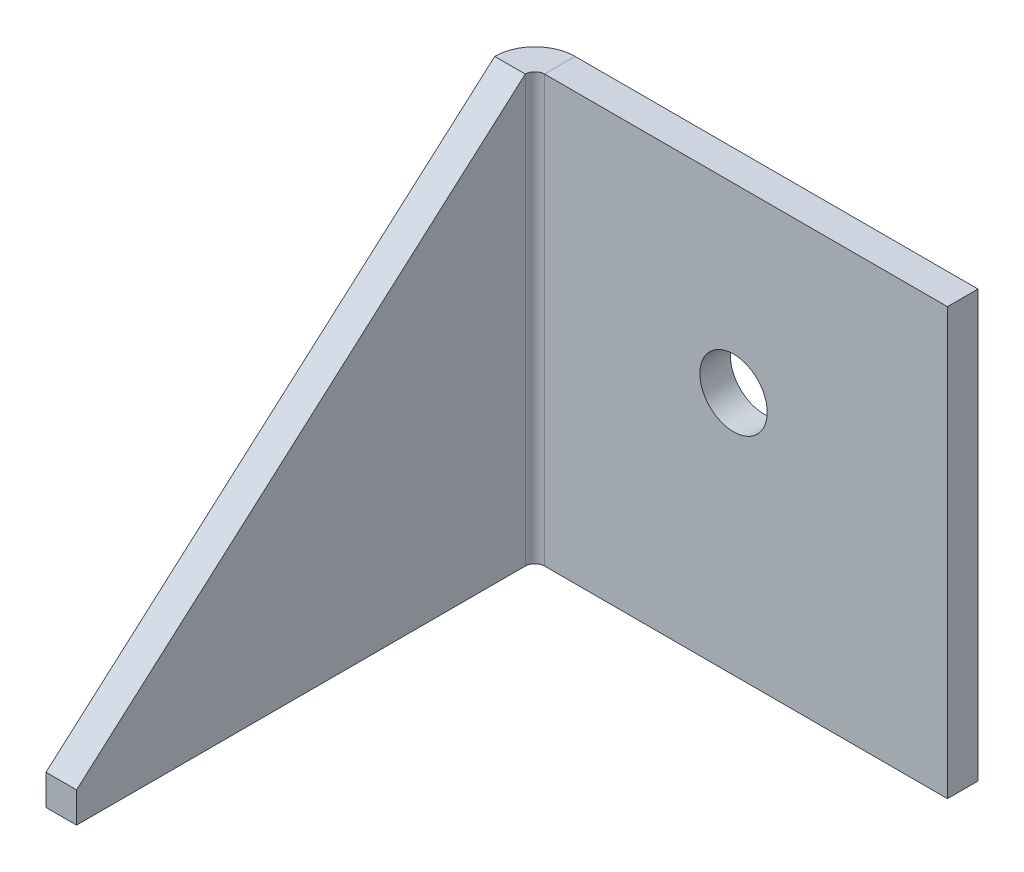
ISO-10303-21;
HEADER;
FILE_DESCRIPTION(('STEP AP214'),'2;1');
FILE_NAME('part.step','',(''),(''),'','','');
FILE_SCHEMA(('AUTOMOTIVE_DESIGN { 1 0 10303 214 1 1 1 1 }'));
ENDSEC;
DATA;
#1=APPLICATION_CONTEXT('core data for automotive mechanical design processes');
#2=APPLICATION_PROTOCOL_DEFINITION('international standard','automotive_design',2000,#1);
#3=PRODUCT_CONTEXT('',#1,'mechanical');
#4=PRODUCT('Part','Part','',(#3));
#5=PRODUCT_RELATED_PRODUCT_CATEGORY('part','',(#4));
#6=PRODUCT_DEFINITION_FORMATION('','',#4);
#7=PRODUCT_DEFINITION_CONTEXT('part definition',#1,'design');
#8=PRODUCT_DEFINITION('design','',#6,#7);
#9=PRODUCT_DEFINITION_SHAPE('','',#8);
#10=(LENGTH_UNIT() NAMED_UNIT(*) SI_UNIT(.MILLI.,.METRE.));
#11=(NAMED_UNIT(*) PLANE_ANGLE_UNIT() SI_UNIT($,.RADIAN.));
#12=(NAMED_UNIT(*) SI_UNIT($,.STERADIAN.) SOLID_ANGLE_UNIT());
#13=UNCERTAINTY_MEASURE_WITH_UNIT(LENGTH_MEASURE(1.E-05),#10,'distance_accuracy_value','');
#14=(GEOMETRIC_REPRESENTATION_CONTEXT(3) GLOBAL_UNCERTAINTY_ASSIGNED_CONTEXT((#13)) GLOBAL_UNIT_ASSIGNED_CONTEXT((#10,
#11,#12)) REPRESENTATION_CONTEXT('',''));
#15=CARTESIAN_POINT('',(0.,0.,0.));
#16=DIRECTION('',(0.,0.,1.));
#17=DIRECTION('',(1.,0.,0.));
#18=AXIS2_PLACEMENT_3D('',#15,#16,#17);
#19=CARTESIAN_POINT('',(0.,0.,0.));
#20=DIRECTION('',(0.,0.,-1.));
#21=DIRECTION('',(-1.,0.,0.));
#22=AXIS2_PLACEMENT_3D('',#19,#20,#21);
#23=PLANE('',#22);
#24=DIRECTION('',(1.,0.,0.));
#25=VECTOR('',#24,1.);
#26=CARTESIAN_POINT('',(-21.43125,-22.13737,0.));
#27=LINE('',#26,#25);
#28=CARTESIAN_POINT('',(-20.43125,-22.13737,0.));
#29=VERTEX_POINT('',#28);
#30=CARTESIAN_POINT('',(21.43125,-22.13737,0.));
#31=VERTEX_POINT('',#30);
#32=EDGE_CURVE('E163',#29,#31,#27,.T.);
#33=ORIENTED_EDGE('',*,*,#32,.F.);
#34=DIRECTION('',(0.,-1.,0.));
#35=VECTOR('',#34,1.);
#36=CARTESIAN_POINT('',(-20.43125,-22.13737,0.));
#37=LINE('',#36,#35);
#38=CARTESIAN_POINT('',(-20.43125,22.13737,0.));
#39=VERTEX_POINT('',#38);
#40=EDGE_CURVE('E139',#29,#39,#37,.F.);
#41=ORIENTED_EDGE('',*,*,#40,.T.);
#42=DIRECTION('',(-1.,0.,0.));
#43=VECTOR('',#42,1.);
#44=CARTESIAN_POINT('',(-21.43125,22.13737,0.));
#45=LINE('',#44,#43);
#46=CARTESIAN_POINT('',(21.43125,22.13737,0.));
#47=VERTEX_POINT('',#46);
#48=EDGE_CURVE('E171',#47,#39,#45,.T.);
#49=ORIENTED_EDGE('',*,*,#48,.F.);
#50=DIRECTION('',(0.,1.,0.));
#51=VECTOR('',#50,1.);
#52=CARTESIAN_POINT('',(21.43125,-22.13737,0.));
#53=LINE('',#52,#51);
#54=EDGE_CURVE('E156',#31,#47,#53,.T.);
#55=ORIENTED_EDGE('',*,*,#54,.F.);
#56=EDGE_LOOP('',(#33,#41,#49,#55));
#57=FACE_BOUND('',#56,.T.);
#58=CARTESIAN_POINT('',(-0.793749999999999,3.26263,0.));
#59=DIRECTION('',(0.,0.,1.));
#60=DIRECTION('',(1.,0.,0.));
#61=AXIS2_PLACEMENT_3D('',#58,#59,#60);
#62=CIRCLE('',#61,3.5);
#63=CARTESIAN_POINT('',(2.70625,3.26263,0.));
#64=VERTEX_POINT('',#63);
#65=EDGE_CURVE('E119',#64,#64,#62,.T.);
#66=ORIENTED_EDGE('',*,*,#65,.T.);
#67=EDGE_LOOP('',(#66));
#68=FACE_BOUND('',#67,.T.);
#69=ADVANCED_FACE('F43',(#57,#68),#23,.T.);
#70=CARTESIAN_POINT('',(0.,0.,3.175));
#71=DIRECTION('',(0.,0.,-1.));
#72=DIRECTION('',(-1.,0.,0.));
#73=AXIS2_PLACEMENT_3D('',#70,#71,#72);
#74=PLANE('',#73);
#75=CARTESIAN_POINT('',(-0.793749999999999,3.26263,3.175));
#76=DIRECTION('',(0.,0.,1.));
#77=DIRECTION('',(1.,0.,0.));
#78=AXIS2_PLACEMENT_3D('',#75,#76,#77);
#79=CIRCLE('',#78,3.49999999999999);
#80=CARTESIAN_POINT('',(2.70624999999999,3.26263,3.175));
#81=VERTEX_POINT('',#80);
#82=EDGE_CURVE('E367',#81,#81,#79,.T.);
#83=ORIENTED_EDGE('',*,*,#82,.F.);
#84=EDGE_LOOP('',(#83));
#85=FACE_BOUND('',#84,.T.);
#86=DIRECTION('',(0.,-1.,0.));
#87=VECTOR('',#86,1.);
#88=CARTESIAN_POINT('',(-20.43125,-22.13737,3.175));
#89=LINE('',#88,#87);
#90=CARTESIAN_POINT('',(-20.43125,-22.13737,3.175));
#91=VERTEX_POINT('',#90);
#92=CARTESIAN_POINT('',(-20.43125,22.13737,3.175));
#93=VERTEX_POINT('',#92);
#94=EDGE_CURVE('E150',#91,#93,#89,.F.);
#95=ORIENTED_EDGE('',*,*,#94,.F.);
#96=DIRECTION('',(1.,0.,0.));
#97=VECTOR('',#96,1.);
#98=CARTESIAN_POINT('',(-21.43125,-22.13737,3.175));
#99=LINE('',#98,#97);
#100=CARTESIAN_POINT('',(21.43125,-22.13737,3.175));
#101=VERTEX_POINT('',#100);
#102=EDGE_CURVE('E166',#91,#101,#99,.T.);
#103=ORIENTED_EDGE('',*,*,#102,.T.);
#104=DIRECTION('',(0.,1.,0.));
#105=VECTOR('',#104,1.);
#106=CARTESIAN_POINT('',(21.43125,-22.13737,3.175));
#107=LINE('',#106,#105);
#108=CARTESIAN_POINT('',(21.43125,22.13737,3.175));
#109=VERTEX_POINT('',#108);
#110=EDGE_CURVE('E159',#101,#109,#107,.T.);
#111=ORIENTED_EDGE('',*,*,#110,.T.);
#112=DIRECTION('',(-1.,0.,0.));
#113=VECTOR('',#112,1.);
#114=CARTESIAN_POINT('',(-21.43125,22.13737,3.175));
#115=LINE('',#114,#113);
#116=EDGE_CURVE('E162',#109,#93,#115,.T.);
#117=ORIENTED_EDGE('',*,*,#116,.T.);
#118=EDGE_LOOP('',(#95,#103,#111,#117));
#119=FACE_BOUND('',#118,.T.);
#120=ADVANCED_FACE('F199',(#85,#119),#74,.F.);
#121=CARTESIAN_POINT('',(-21.43125,22.13737,3.175));
#122=DIRECTION('',(0.,-1.,0.));
#123=DIRECTION('',(0.,0.,-1.));
#124=AXIS2_PLACEMENT_3D('',#121,#122,#123);
#125=PLANE('',#124);
#126=DIRECTION('',(0.,0.,-1.));
#127=VECTOR('',#126,1.);
#128=CARTESIAN_POINT('',(-20.43125,22.13737,3.175));
#129=LINE('',#128,#127);
#130=EDGE_CURVE('E154',#93,#39,#129,.T.);
#131=ORIENTED_EDGE('',*,*,#130,.F.);
#132=ORIENTED_EDGE('',*,*,#116,.F.);
#133=DIRECTION('',(0.,0.,-1.));
#134=VECTOR('',#133,1.);
#135=CARTESIAN_POINT('',(21.43125,22.13737,3.175));
#136=LINE('',#135,#134);
#137=EDGE_CURVE('E51',#109,#47,#136,.T.);
#138=ORIENTED_EDGE('',*,*,#137,.T.);
#139=ORIENTED_EDGE('',*,*,#48,.T.);
#140=EDGE_LOOP('',(#131,#132,#138,#139));
#141=FACE_BOUND('',#140,.T.);
#142=ADVANCED_FACE('F180',(#141),#125,.F.);
#143=CARTESIAN_POINT('',(-21.43125,-22.13737,3.175));
#144=DIRECTION('',(0.,1.,0.));
#145=DIRECTION('',(0.,0.,1.));
#146=AXIS2_PLACEMENT_3D('',#143,#144,#145);
#147=PLANE('',#146);
#148=DIRECTION('',(0.,0.,-1.));
#149=VECTOR('',#148,1.);
#150=CARTESIAN_POINT('',(-20.43125,-22.13737,3.175));
#151=LINE('',#150,#149);
#152=EDGE_CURVE('E144',#91,#29,#151,.T.);
#153=ORIENTED_EDGE('',*,*,#152,.T.);
#154=ORIENTED_EDGE('',*,*,#32,.T.);
#155=DIRECTION('',(0.,0.,-1.));
#156=VECTOR('',#155,1.);
#157=CARTESIAN_POINT('',(21.43125,-22.13737,3.175));
#158=LINE('',#157,#156);
#159=EDGE_CURVE('E168',#101,#31,#158,.T.);
#160=ORIENTED_EDGE('',*,*,#159,.F.);
#161=ORIENTED_EDGE('',*,*,#102,.F.);
#162=EDGE_LOOP('',(#153,#154,#160,#161));
#163=FACE_BOUND('',#162,.T.);
#164=ADVANCED_FACE('F196',(#163),#147,.F.);
#165=CARTESIAN_POINT('',(21.43125,-22.13737,3.175));
#166=DIRECTION('',(-1.,0.,0.));
#167=DIRECTION('',(0.,0.,1.));
#168=AXIS2_PLACEMENT_3D('',#165,#166,#167);
#169=PLANE('',#168);
#170=ORIENTED_EDGE('',*,*,#54,.T.);
#171=ORIENTED_EDGE('',*,*,#137,.F.);
#172=ORIENTED_EDGE('',*,*,#110,.F.);
#173=ORIENTED_EDGE('',*,*,#159,.T.);
#174=EDGE_LOOP('',(#170,#171,#172,#173));
#175=FACE_BOUND('',#174,.T.);
#176=ADVANCED_FACE('F45',(#175),#169,.F.);
#177=CARTESIAN_POINT('',(-20.43125,22.13737,4.175));
#178=DIRECTION('',(0.,1.,0.));
#179=DIRECTION('',(0.,0.,1.));
#180=AXIS2_PLACEMENT_3D('',#177,#178,#179);
#181=PLANE('',#180);
#182=DIRECTION('',(-1.,0.,0.));
#183=VECTOR('',#182,1.);
#184=CARTESIAN_POINT('',(-21.43125,22.13737,4.175));
#185=LINE('',#184,#183);
#186=CARTESIAN_POINT('',(-21.43125,22.13737,4.175));
#187=VERTEX_POINT('',#186);
#188=CARTESIAN_POINT('',(-24.6062500000001,22.13737,4.17499999999999));
#189=VERTEX_POINT('',#188);
#190=EDGE_CURVE('E205',#187,#189,#185,.T.);
#191=ORIENTED_EDGE('',*,*,#190,.F.);
#192=CARTESIAN_POINT('',(-20.43125,22.13737,4.175));
#193=DIRECTION('',(0.,-1.,0.));
#194=DIRECTION('',(0.,0.,-1.));
#195=AXIS2_PLACEMENT_3D('',#192,#193,#194);
#196=CIRCLE('',#195,1.);
#197=EDGE_CURVE('E147',#93,#187,#196,.F.);
#198=ORIENTED_EDGE('',*,*,#197,.F.);
#199=ORIENTED_EDGE('',*,*,#130,.T.);
#200=CARTESIAN_POINT('',(-20.43125,22.13737,4.175));
#201=DIRECTION('',(0.,-1.,0.));
#202=DIRECTION('',(0.,0.,-1.));
#203=AXIS2_PLACEMENT_3D('',#200,#201,#202);
#204=CIRCLE('',#203,4.175);
#205=EDGE_CURVE('E65',#39,#189,#204,.F.);
#206=ORIENTED_EDGE('',*,*,#205,.T.);
#207=EDGE_LOOP('',(#191,#198,#199,#206));
#208=FACE_BOUND('',#207,.T.);
#209=ADVANCED_FACE('F204',(#208),#181,.T.);
#210=CARTESIAN_POINT('',(-20.43125,-22.13737,4.175));
#211=DIRECTION('',(0.,1.,0.));
#212=DIRECTION('',(0.,0.,1.));
#213=AXIS2_PLACEMENT_3D('',#210,#211,#212);
#214=PLANE('',#213);
#215=CARTESIAN_POINT('',(-20.43125,-22.13737,4.175));
#216=DIRECTION('',(0.,-1.,0.));
#217=DIRECTION('',(0.,0.,-1.));
#218=AXIS2_PLACEMENT_3D('',#215,#216,#217);
#219=CIRCLE('',#218,1.);
#220=CARTESIAN_POINT('',(-21.43125,-22.13737,4.175));
#221=VERTEX_POINT('',#220);
#222=EDGE_CURVE('E138',#221,#91,#219,.T.);
#223=ORIENTED_EDGE('',*,*,#222,.F.);
#224=DIRECTION('',(-1.,0.,0.));
#225=VECTOR('',#224,1.);
#226=CARTESIAN_POINT('',(-21.43125,-22.13737,4.175));
#227=LINE('',#226,#225);
#228=CARTESIAN_POINT('',(-24.60625,-22.13737,4.17499999999999));
#229=VERTEX_POINT('',#228);
#230=EDGE_CURVE('E131',#221,#229,#227,.T.);
#231=ORIENTED_EDGE('',*,*,#230,.T.);
#232=CARTESIAN_POINT('',(-20.43125,-22.13737,4.175));
#233=DIRECTION('',(0.,-1.,0.));
#234=DIRECTION('',(0.,0.,-1.));
#235=AXIS2_PLACEMENT_3D('',#232,#233,#234);
#236=CIRCLE('',#235,4.175);
#237=EDGE_CURVE('E142',#229,#29,#236,.T.);
#238=ORIENTED_EDGE('',*,*,#237,.T.);
#239=ORIENTED_EDGE('',*,*,#152,.F.);
#240=EDGE_LOOP('',(#223,#231,#238,#239));
#241=FACE_BOUND('',#240,.T.);
#242=ADVANCED_FACE('F192',(#241),#214,.F.);
#243=CARTESIAN_POINT('',(-20.43125,-22.13737,4.175));
#244=DIRECTION('',(0.,-1.,0.));
#245=DIRECTION('',(-1.,0.,0.));
#246=AXIS2_PLACEMENT_3D('',#243,#244,#245);
#247=CYLINDRICAL_SURFACE('',#246,4.175);
#248=ORIENTED_EDGE('',*,*,#40,.F.);
#249=ORIENTED_EDGE('',*,*,#237,.F.);
#250=DIRECTION('',(0.,-1.,0.));
#251=VECTOR('',#250,1.);
#252=CARTESIAN_POINT('',(-24.60625,0.,4.17499999999999));
#253=LINE('',#252,#251);
#254=EDGE_CURVE('E126',#189,#229,#253,.T.);
#255=ORIENTED_EDGE('',*,*,#254,.F.);
#256=ORIENTED_EDGE('',*,*,#205,.F.);
#257=EDGE_LOOP('',(#248,#249,#255,#256));
#258=FACE_BOUND('',#257,.T.);
#259=ADVANCED_FACE('F188',(#258),#247,.T.);
#260=CARTESIAN_POINT('',(-20.43125,-22.13737,4.175));
#261=DIRECTION('',(0.,-1.,0.));
#262=DIRECTION('',(-1.,0.,0.));
#263=AXIS2_PLACEMENT_3D('',#260,#261,#262);
#264=CYLINDRICAL_SURFACE('',#263,1.);
#265=ORIENTED_EDGE('',*,*,#94,.T.);
#266=ORIENTED_EDGE('',*,*,#197,.T.);
#267=DIRECTION('',(0.,-1.,0.));
#268=VECTOR('',#267,1.);
#269=CARTESIAN_POINT('',(-21.43125,22.13737,4.175));
#270=LINE('',#269,#268);
#271=EDGE_CURVE('E118',#187,#221,#270,.T.);
#272=ORIENTED_EDGE('',*,*,#271,.T.);
#273=ORIENTED_EDGE('',*,*,#222,.T.);
#274=EDGE_LOOP('',(#265,#266,#272,#273));
#275=FACE_BOUND('',#274,.T.);
#276=ADVANCED_FACE('F202',(#275),#264,.F.);
#277=CARTESIAN_POINT('',(-24.60625,-22.13737,3.17499999999999));
#278=DIRECTION('',(0.,-1.,0.));
#279=DIRECTION('',(0.,0.,-1.));
#280=AXIS2_PLACEMENT_3D('',#277,#278,#279);
#281=PLANE('',#280);
#282=DIRECTION('',(0.,0.,-1.));
#283=VECTOR('',#282,1.);
#284=CARTESIAN_POINT('',(-24.60625,-22.13737,3.17499999999999));
#285=LINE('',#284,#283);
#286=CARTESIAN_POINT('',(-24.6062500000002,-22.13737,50.8));
#287=VERTEX_POINT('',#286);
#288=EDGE_CURVE('E134',#287,#229,#285,.T.);
#289=ORIENTED_EDGE('',*,*,#288,.T.);
#290=ORIENTED_EDGE('',*,*,#230,.F.);
#291=DIRECTION('',(0.,0.,-1.));
#292=VECTOR('',#291,1.);
#293=CARTESIAN_POINT('',(-21.43125,-22.13737,3.175));
#294=LINE('',#293,#292);
#295=CARTESIAN_POINT('',(-21.4312500000002,-22.13737,50.8));
#296=VERTEX_POINT('',#295);
#297=EDGE_CURVE('E125',#296,#221,#294,.T.);
#298=ORIENTED_EDGE('',*,*,#297,.F.);
#299=DIRECTION('',(1.,0.,0.));
#300=VECTOR('',#299,1.);
#301=CARTESIAN_POINT('',(-24.6062500000002,-22.13737,50.8));
#302=LINE('',#301,#300);
#303=EDGE_CURVE('E123',#287,#296,#302,.T.);
#304=ORIENTED_EDGE('',*,*,#303,.F.);
#305=EDGE_LOOP('',(#289,#290,#298,#304));
#306=FACE_BOUND('',#305,.T.);
#307=ADVANCED_FACE('F213',(#306),#281,.T.);
#308=CARTESIAN_POINT('',(-24.60625,0.,0.));
#309=DIRECTION('',(-1.,0.,0.));
#310=DIRECTION('',(0.,0.,1.));
#311=AXIS2_PLACEMENT_3D('',#308,#309,#310);
#312=PLANE('',#311);
#313=DIRECTION('',(0.,-0.661260019376206,0.750156774797495));
#314=VECTOR('',#313,1.);
#315=CARTESIAN_POINT('',(-24.60625,14.5284802950008,12.8067938384912));
#316=LINE('',#315,#314);
#317=CARTESIAN_POINT('',(-24.6062500000002,-18.96237,50.8));
#318=VERTEX_POINT('',#317);
#319=EDGE_CURVE('E57',#189,#318,#316,.T.);
#320=ORIENTED_EDGE('',*,*,#319,.F.);
#321=ORIENTED_EDGE('',*,*,#254,.T.);
#322=ORIENTED_EDGE('',*,*,#288,.F.);
#323=DIRECTION('',(0.,-1.,0.));
#324=VECTOR('',#323,1.);
#325=CARTESIAN_POINT('',(-24.6062500000002,-22.13737,50.8));
#326=LINE('',#325,#324);
#327=EDGE_CURVE('E128',#318,#287,#326,.T.);
#328=ORIENTED_EDGE('',*,*,#327,.F.);
#329=EDGE_LOOP('',(#320,#321,#322,#328));
#330=FACE_BOUND('',#329,.T.);
#331=ADVANCED_FACE('F215',(#330),#312,.T.);
#332=CARTESIAN_POINT('',(-21.43125,0.,0.));
#333=DIRECTION('',(-1.,0.,0.));
#334=DIRECTION('',(0.,0.,1.));
#335=AXIS2_PLACEMENT_3D('',#332,#333,#334);
#336=PLANE('',#335);
#337=ORIENTED_EDGE('',*,*,#271,.F.);
#338=DIRECTION('',(0.,0.661260019376206,-0.750156774797495));
#339=VECTOR('',#338,1.);
#340=CARTESIAN_POINT('',(-21.43125,14.5284802950008,12.8067938384912));
#341=LINE('',#340,#339);
#342=CARTESIAN_POINT('',(-21.4312500000002,-18.96237,50.8));
#343=VERTEX_POINT('',#342);
#344=EDGE_CURVE('E107',#343,#187,#341,.T.);
#345=ORIENTED_EDGE('',*,*,#344,.F.);
#346=DIRECTION('',(0.,-1.,0.));
#347=VECTOR('',#346,1.);
#348=CARTESIAN_POINT('',(-21.4312500000002,-22.13737,50.8));
#349=LINE('',#348,#347);
#350=EDGE_CURVE('E116',#343,#296,#349,.T.);
#351=ORIENTED_EDGE('',*,*,#350,.T.);
#352=ORIENTED_EDGE('',*,*,#297,.T.);
#353=EDGE_LOOP('',(#337,#345,#351,#352));
#354=FACE_BOUND('',#353,.T.);
#355=ADVANCED_FACE('F114',(#354),#336,.F.);
#356=CARTESIAN_POINT('',(-24.6062500000002,-22.13737,50.8));
#357=DIRECTION('',(0.,0.,1.));
#358=DIRECTION('',(1.,0.,0.));
#359=AXIS2_PLACEMENT_3D('',#356,#357,#358);
#360=PLANE('',#359);
#361=DIRECTION('',(1.,0.,0.));
#362=VECTOR('',#361,1.);
#363=CARTESIAN_POINT('',(-24.6062500000002,-18.96237,50.8));
#364=LINE('',#363,#362);
#365=EDGE_CURVE('E11',#318,#343,#364,.T.);
#366=ORIENTED_EDGE('',*,*,#365,.F.);
#367=ORIENTED_EDGE('',*,*,#327,.T.);
#368=ORIENTED_EDGE('',*,*,#303,.T.);
#369=ORIENTED_EDGE('',*,*,#350,.F.);
#370=EDGE_LOOP('',(#366,#367,#368,#369));
#371=FACE_BOUND('',#370,.T.);
#372=ADVANCED_FACE('F121',(#371),#360,.T.);
#373=CARTESIAN_POINT('',(-24.606262,14.5284802950008,12.8067938384912));
#374=DIRECTION('',(0.,-0.750156774797495,-0.661260019376206));
#375=DIRECTION('',(0.,0.661260019376206,-0.750156774797495));
#376=AXIS2_PLACEMENT_3D('',#373,#374,#375);
#377=PLANE('',#376);
#378=ORIENTED_EDGE('',*,*,#319,.T.);
#379=ORIENTED_EDGE('',*,*,#365,.T.);
#380=ORIENTED_EDGE('',*,*,#344,.T.);
#381=ORIENTED_EDGE('',*,*,#190,.T.);
#382=EDGE_LOOP('',(#378,#379,#380,#381));
#383=FACE_BOUND('',#382,.T.);
#384=ADVANCED_FACE('F106',(#383),#377,.F.);
#385=CARTESIAN_POINT('',(-0.793749999999999,3.26263,3.175));
#386=DIRECTION('',(0.,0.,1.));
#387=DIRECTION('',(1.,0.,0.));
#388=AXIS2_PLACEMENT_3D('',#385,#386,#387);
#389=CYLINDRICAL_SURFACE('',#388,3.49999999999999);
#390=ORIENTED_EDGE('',*,*,#65,.F.);
#391=EDGE_LOOP('',(#390));
#392=FACE_BOUND('',#391,.T.);
#393=ORIENTED_EDGE('',*,*,#82,.T.);
#394=EDGE_LOOP('',(#393));
#395=FACE_BOUND('',#394,.T.);
#396=ADVANCED_FACE('F318',(#392,#395),#389,.F.);
#397=CLOSED_SHELL('',(#69,#120,#142,#164,#176,#209,#242,#259,#276,#307,#331,#355,#372,#384,#396));
#398=MANIFOLD_SOLID_BREP('B2',#397);
#399=ADVANCED_BREP_SHAPE_REPRESENTATION('',(#18,#398),#14);
#400=SHAPE_DEFINITION_REPRESENTATION(#9,#399);
ENDSEC;
END-ISO-10303-21;
